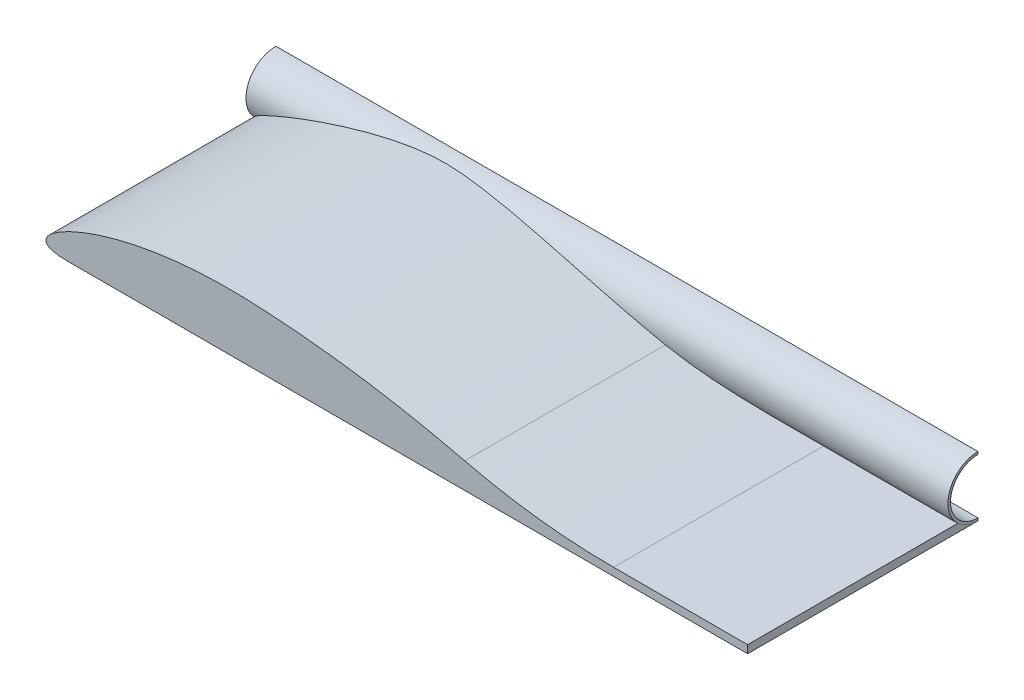
ISO-10303-21;
HEADER;
FILE_DESCRIPTION(('STEP AP214'),'2;1');
FILE_NAME('part.step','',(''),(''),'','','');
FILE_SCHEMA(('AUTOMOTIVE_DESIGN { 1 0 10303 214 1 1 1 1 }'));
ENDSEC;
DATA;
#1=APPLICATION_CONTEXT('core data for automotive mechanical design processes');
#2=APPLICATION_PROTOCOL_DEFINITION('international standard','automotive_design',2000,#1);
#3=PRODUCT_CONTEXT('',#1,'mechanical');
#4=PRODUCT('Part','Part','',(#3));
#5=PRODUCT_RELATED_PRODUCT_CATEGORY('part','',(#4));
#6=PRODUCT_DEFINITION_FORMATION('','',#4);
#7=PRODUCT_DEFINITION_CONTEXT('part definition',#1,'design');
#8=PRODUCT_DEFINITION('design','',#6,#7);
#9=PRODUCT_DEFINITION_SHAPE('','',#8);
#10=(LENGTH_UNIT() NAMED_UNIT(*) SI_UNIT(.MILLI.,.METRE.));
#11=(NAMED_UNIT(*) PLANE_ANGLE_UNIT() SI_UNIT($,.RADIAN.));
#12=(NAMED_UNIT(*) SI_UNIT($,.STERADIAN.) SOLID_ANGLE_UNIT());
#13=UNCERTAINTY_MEASURE_WITH_UNIT(LENGTH_MEASURE(1.E-05),#10,'distance_accuracy_value','');
#14=(GEOMETRIC_REPRESENTATION_CONTEXT(3) GLOBAL_UNCERTAINTY_ASSIGNED_CONTEXT((#13)) GLOBAL_UNIT_ASSIGNED_CONTEXT((#10,
#11,#12)) REPRESENTATION_CONTEXT('',''));
#15=CARTESIAN_POINT('',(0.,0.,0.));
#16=DIRECTION('',(0.,0.,1.));
#17=DIRECTION('',(1.,0.,0.));
#18=AXIS2_PLACEMENT_3D('',#15,#16,#17);
#19=CARTESIAN_POINT('',(0.,0.,0.));
#20=DIRECTION('',(0.,0.,1.));
#21=DIRECTION('',(1.,0.,0.));
#22=AXIS2_PLACEMENT_3D('',#19,#20,#21);
#23=PLANE('',#22);
#24=DIRECTION('',(0.,1.,0.));
#25=VECTOR('',#24,1.);
#26=CARTESIAN_POINT('',(-1.16956159429626,0.,0.));
#27=LINE('',#26,#25);
#28=CARTESIAN_POINT('',(-1.16956159429626,-3.58400593643312,0.));
#29=VERTEX_POINT('',#28);
#30=CARTESIAN_POINT('',(-1.16956159429626,-1.55200593643312,0.));
#31=VERTEX_POINT('',#30);
#32=EDGE_CURVE('E121',#29,#31,#27,.T.);
#33=ORIENTED_EDGE('',*,*,#32,.T.);
#34=DIRECTION('',(1.,0.,0.));
#35=VECTOR('',#34,1.);
#36=CARTESIAN_POINT('',(-52.6289643327539,-1.55200593643312,0.));
#37=LINE('',#36,#35);
#38=CARTESIAN_POINT('',(563.880012,-1.55200593643312,0.));
#39=VERTEX_POINT('',#38);
#40=EDGE_CURVE('E108',#31,#39,#37,.T.);
#41=ORIENTED_EDGE('',*,*,#40,.T.);
#42=DIRECTION('',(0.,1.,0.));
#43=VECTOR('',#42,1.);
#44=CARTESIAN_POINT('',(563.880012,0.,0.));
#45=LINE('',#44,#43);
#46=CARTESIAN_POINT('',(563.880006,-3.58400593643312,0.));
#47=VERTEX_POINT('',#46);
#48=EDGE_CURVE('E118',#47,#39,#45,.T.);
#49=ORIENTED_EDGE('',*,*,#48,.F.);
#50=DIRECTION('',(1.,0.,0.));
#51=VECTOR('',#50,1.);
#52=CARTESIAN_POINT('',(0.,-3.58400593643312,0.));
#53=LINE('',#52,#51);
#54=CARTESIAN_POINT('',(16.8244862805457,-3.58400593643312,0.));
#55=VERTEX_POINT('',#54);
#56=EDGE_CURVE('E139',#55,#47,#53,.T.);
#57=ORIENTED_EDGE('',*,*,#56,.F.);
#58=DIRECTION('',(1.,0.,0.));
#59=VECTOR('',#58,1.);
#60=CARTESIAN_POINT('',(-1.16956159429626,-3.58400593643312,0.));
#61=LINE('',#60,#59);
#62=EDGE_CURVE('E193',#29,#55,#61,.T.);
#63=ORIENTED_EDGE('',*,*,#62,.F.);
#64=EDGE_LOOP('',(#33,#41,#49,#57,#63));
#65=FACE_BOUND('',#64,.T.);
#66=ADVANCED_FACE('F35',(#65),#23,.F.);
#67=CARTESIAN_POINT('',(0.,2.76599406356662,185.42));
#68=DIRECTION('',(0.,-1.,0.));
#69=DIRECTION('',(1.,0.,0.));
#70=AXIS2_PLACEMENT_3D('',#67,#68,#69);
#71=PLANE('',#70);
#72=DIRECTION('',(1.,0.,0.));
#73=VECTOR('',#72,1.);
#74=CARTESIAN_POINT('',(-1.16956159429626,2.76599406356663,16.3134453749044));
#75=LINE('',#74,#73);
#76=CARTESIAN_POINT('',(455.986702340772,2.76599406356692,16.3134453749048));
#77=VERTEX_POINT('',#76);
#78=CARTESIAN_POINT('',(563.88,2.76599406356663,16.3134453749044));
#79=VERTEX_POINT('',#78);
#80=EDGE_CURVE('E128',#77,#79,#75,.T.);
#81=ORIENTED_EDGE('',*,*,#80,.F.);
#82=DIRECTION('',(0.,0.,1.));
#83=VECTOR('',#82,1.);
#84=CARTESIAN_POINT('',(455.986702340772,2.76599406356683,185.42));
#85=LINE('',#84,#83);
#86=CARTESIAN_POINT('',(455.986702340772,2.76599406356683,185.42));
#87=VERTEX_POINT('',#86);
#88=EDGE_CURVE('E62',#77,#87,#85,.T.);
#89=ORIENTED_EDGE('',*,*,#88,.T.);
#90=DIRECTION('',(-1.,0.,0.));
#91=VECTOR('',#90,1.);
#92=CARTESIAN_POINT('',(0.,2.76599406356662,185.42));
#93=LINE('',#92,#91);
#94=CARTESIAN_POINT('',(563.88,2.76599406356688,185.42));
#95=VERTEX_POINT('',#94);
#96=EDGE_CURVE('E135',#95,#87,#93,.T.);
#97=ORIENTED_EDGE('',*,*,#96,.F.);
#98=DIRECTION('',(0.,0.,-1.));
#99=VECTOR('',#98,1.);
#100=CARTESIAN_POINT('',(563.88,2.76599406356688,185.42));
#101=LINE('',#100,#99);
#102=EDGE_CURVE('E215',#95,#79,#101,.T.);
#103=ORIENTED_EDGE('',*,*,#102,.T.);
#104=EDGE_LOOP('',(#81,#89,#97,#103));
#105=FACE_BOUND('',#104,.T.);
#106=ADVANCED_FACE('F155',(#105),#71,.F.);
#107=CARTESIAN_POINT('',(397.402740733893,0.,185.42));
#108=CARTESIAN_POINT('',(397.411698055032,0.038885320403436,185.42));
#109=CARTESIAN_POINT('',(395.109063505421,0.667730492670391,185.42));
#110=CARTESIAN_POINT('',(392.784748718469,1.49199113491221,185.42));
#111=CARTESIAN_POINT('',(387.041714069542,3.20797201327392,185.42));
#112=CARTESIAN_POINT('',(379.954865000334,5.35658969865723,185.42));
#113=CARTESIAN_POINT('',(370.615780699372,8.05897955921893,185.42));
#114=CARTESIAN_POINT('',(359.507412748466,11.1431063312715,185.42));
#115=CARTESIAN_POINT('',(346.598869357543,14.5438713747355,185.42));
#116=CARTESIAN_POINT('',(332.061103090113,18.1288417989651,185.42));
#117=CARTESIAN_POINT('',(316.038892879882,21.8064155050036,185.42));
#118=CARTESIAN_POINT('',(298.691944357754,25.449886624153,185.42));
#119=CARTESIAN_POINT('',(280.209065946268,28.9588443293727,185.42));
#120=CARTESIAN_POINT('',(260.784413321996,32.2270252294116,185.42));
#121=CARTESIAN_POINT('',(240.627196048796,35.1598340983636,185.42));
#122=CARTESIAN_POINT('',(219.959471218607,37.67781805282,185.42));
#123=CARTESIAN_POINT('',(199.01149733823,39.7118853380755,185.42));
#124=CARTESIAN_POINT('',(178.012037109444,41.1804944444643,185.42));
#125=CARTESIAN_POINT('',(157.089436587516,42.139263372195,185.42));
#126=CARTESIAN_POINT('',(136.464680266551,42.2131749394883,185.42));
#127=CARTESIAN_POINT('',(116.414649466667,41.217940478165,185.42));
#128=CARTESIAN_POINT('',(97.30433097571,39.2984877838289,185.42));
#129=CARTESIAN_POINT('',(79.3799866186788,36.5495213442708,185.42));
#130=CARTESIAN_POINT('',(62.8681190648392,33.1147834871376,185.42));
#131=CARTESIAN_POINT('',(47.9655542938233,29.1739071161229,185.42));
#132=CARTESIAN_POINT('',(34.850979219968,24.8995128608497,185.42));
#133=CARTESIAN_POINT('',(23.6592605092071,20.5034094565773,185.42));
#134=CARTESIAN_POINT('',(14.5152980764796,16.1324942141789,185.42));
#135=CARTESIAN_POINT('',(7.44822395064549,12.0104976420917,185.42));
#136=CARTESIAN_POINT('',(2.54712627731124,8.16899422843115,185.42));
#137=CARTESIAN_POINT('',(-0.453384309126816,4.79279174210024,185.42));
#138=CARTESIAN_POINT('',(-1.16956159429625,1.10557529626499,185.42));
#139=CARTESIAN_POINT('',(1.41486830061476,-1.60410388651566,185.42));
#140=CARTESIAN_POINT('',(5.70098263570552,-2.84077269687765,185.42));
#141=CARTESIAN_POINT('',(11.7555244989561,-3.57445206902531,185.42));
#142=CARTESIAN_POINT('',(19.6987641608015,-3.6327457960979,185.42));
#143=CARTESIAN_POINT('',(29.4506872946603,-3.17318046215981,185.42));
#144=CARTESIAN_POINT('',(40.9133147322604,-2.23102229721433,185.42));
#145=CARTESIAN_POINT('',(53.9547343819028,-0.933620653111706,185.42));
#146=CARTESIAN_POINT('',(68.4418443218216,0.603641828697804,185.42));
#147=CARTESIAN_POINT('',(84.2200775935775,2.26179395625605,185.42));
#148=CARTESIAN_POINT('',(101.146412331284,3.90001725460771,185.42));
#149=CARTESIAN_POINT('',(119.057408579271,5.37100954783997,185.42));
#150=CARTESIAN_POINT('',(137.798850975262,6.57353185564482,185.42));
#151=CARTESIAN_POINT('',(157.307672245746,7.34803820882025,185.42));
#152=CARTESIAN_POINT('',(177.401590339587,7.7535348034742,185.42));
#153=CARTESIAN_POINT('',(197.867291710901,8.10629507872485,185.42));
#154=CARTESIAN_POINT('',(218.383935910607,8.25382990528894,185.42));
#155=CARTESIAN_POINT('',(238.720913992722,8.21180933346506,185.42));
#156=CARTESIAN_POINT('',(258.65927683326,7.95581265533055,185.42));
#157=CARTESIAN_POINT('',(277.981187946263,7.50085728926565,185.42));
#158=CARTESIAN_POINT('',(296.474222895194,6.86319583158048,185.42));
#159=CARTESIAN_POINT('',(313.932531106465,6.08399675056258,185.42));
#160=CARTESIAN_POINT('',(330.158311416149,5.19874258601101,185.42));
#161=CARTESIAN_POINT('',(344.958833394524,4.26578253175616,185.42));
#162=CARTESIAN_POINT('',(358.177232855869,3.32463445264578,185.42));
#163=CARTESIAN_POINT('',(369.605973842651,2.44215040704408,185.42));
#164=CARTESIAN_POINT('',(379.256357552193,1.63364963837423,185.42));
#165=CARTESIAN_POINT('',(386.613193972221,1.00338863630718,185.42));
#166=CARTESIAN_POINT('',(392.568540150879,0.420302648445525,185.42));
#167=CARTESIAN_POINT('',(395.032189851431,0.277232580315452,185.42));
#168=CARTESIAN_POINT('',(397.393838715057,-0.0386452432959012,185.42));
#169=CARTESIAN_POINT('',(397.402740733893,0.,185.42));
#170=B_SPLINE_CURVE_WITH_KNOTS('',3,(#107,#108,#109,#110,#111,#112,#113,#114,#115,#116,#117,
#118,#119,#120,#121,#122,#123,#124,#125,#126,#127,#128,#129,#130,#131,#132,#133,#134,#135,#136,
#137,#138,#139,#140,#141,#142,#143,#144,#145,#146,#147,#148,#149,#150,#151,#152,#153,#154,#155,
#156,#157,#158,#159,#160,#161,#162,#163,#164,#165,#166,#167,#168,#169),.UNSPECIFIED.,.T.,.F.,(4,
1,1,1,1,1,1,1,1,1,1,1,1,1,1,1,1,1,1,1,1,1,1,1,1,1,1,1,1,1,1,1,1,1,1,1,1,1,1,1,1,1,1,1,1,1,1,1,1,
1,1,1,1,1,1,1,1,1,1,1,4),(0.,0.00137455348322331,0.00548449728179396,0.0122733609908927,
0.021682195504866,0.0335806119079948,0.0478307427867091,0.0643059527211734,0.082777332043007,
0.103063756455997,0.124929016786915,0.148149110667858,0.172444694611559,0.197572105868171,
0.223268880537162,0.249227774933554,0.275186209349679,0.300900708934774,0.326462938278696,
0.351222485186767,0.374905858971967,0.397269706218861,0.418072413969665,0.437079533175026,
0.454093093767394,0.468919631578705,0.48139171235289,0.491447126518173,0.499023571234557,
0.504293734329401,0.507921918342,0.511539686153778,0.516780527527172,0.524216490268905,
0.533991629403711,0.546033957270731,0.560220284382465,0.576403357410148,0.594370816485922,
0.613951103581465,0.634916884969972,0.657088503485648,0.680229909573905,0.704175481107386,
0.72909036740664,0.754353775526935,0.779667752347888,0.804760119952374,0.829359338708984,
0.853208710008459,0.876041363199166,0.897604065496152,0.917662212410958,0.935969860405553,
0.952309787739252,0.966502759006892,0.978350082728452,0.987731492337842,0.994510920242662,
0.998633932979557,1.),.UNSPECIFIED.);
#171=DIRECTION('',(0.,0.,-1.));
#172=VECTOR('',#171,1.);
#173=SURFACE_OF_LINEAR_EXTRUSION('',#170,#172);
#174=CARTESIAN_POINT('',(336.21803103568,17.0864771967916,23.8807169709893));
#175=CARTESIAN_POINT('',(335.437780249943,17.2757644204646,23.9081364651268));
#176=CARTESIAN_POINT('',(334.657214541211,17.4640931034819,23.9331232093968));
#177=CARTESIAN_POINT('',(333.095490141557,17.8388368753126,23.978403647457));
#178=CARTESIAN_POINT('',(332.314331452396,18.0252519697809,23.9986973551197));
#179=CARTESIAN_POINT('',(329.969668457196,18.5817158477031,24.0528057971885));
#180=CARTESIAN_POINT('',(328.405322557292,18.9488994591967,24.0798358683195));
#181=CARTESIAN_POINT('',(325.274298396243,19.6754861046501,24.1170368268345));
#182=CARTESIAN_POINT('',(323.707619725699,20.0348875421759,24.127204286764));
#183=CARTESIAN_POINT('',(320.572171296696,20.7457180526098,24.1317911536522));
#184=CARTESIAN_POINT('',(319.003401244768,21.0971458458174,24.1262080505537));
#185=CARTESIAN_POINT('',(315.864013538495,21.7918122816116,24.1003250906715));
#186=CARTESIAN_POINT('',(314.293395719207,22.1350501239534,24.0800238017986));
#187=CARTESIAN_POINT('',(311.141886800089,22.8151773024117,24.0255017960916));
#188=CARTESIAN_POINT('',(309.560987134852,23.152020729293,23.9912043137153));
#189=CARTESIAN_POINT('',(306.397858783431,23.8174039442358,23.9095612296842));
#190=CARTESIAN_POINT('',(304.815630163918,24.1459441258267,23.8622162476824));
#191=CARTESIAN_POINT('',(301.650104291215,24.7947314517675,23.7552774422097));
#192=CARTESIAN_POINT('',(300.066807204176,25.1149796713707,23.6956852159382));
#193=CARTESIAN_POINT('',(296.89940616505,25.7471889334053,23.5649873717921));
#194=CARTESIAN_POINT('',(295.315302474069,26.0591518210568,23.4938843429376));
#195=CARTESIAN_POINT('',(292.146532218502,26.6747000738358,23.3408742026462));
#196=CARTESIAN_POINT('',(290.561866009426,26.9782881555916,23.2589706457355));
#197=CARTESIAN_POINT('',(287.194480590991,27.6143599486084,23.0741846792148));
#198=CARTESIAN_POINT('',(285.411627483541,27.9457447495862,22.9699600476065));
#199=CARTESIAN_POINT('',(281.84469517669,28.597922590884,22.7495457402765));
#200=CARTESIAN_POINT('',(280.060615958892,28.9187154685767,22.6333558809545));
#201=CARTESIAN_POINT('',(276.491336141933,29.5496379793594,22.3898551133518));
#202=CARTESIAN_POINT('',(274.706135538111,29.8597675678198,22.2625441585332));
#203=CARTESIAN_POINT('',(267.56439866628,31.0786416986716,21.7327842358815));
#204=CARTESIAN_POINT('',(262.20344871317,31.9445554313976,21.2891361659619));
#205=CARTESIAN_POINT('',(255.049349438321,33.0339672147566,20.6496287341452));
#206=CARTESIAN_POINT('',(253.259752555489,33.3009716910499,20.4857002206553));
#207=CARTESIAN_POINT('',(249.679627756892,33.8240631151889,20.1505899717768));
#208=CARTESIAN_POINT('',(247.889099840435,34.0801500549142,19.9794082309934));
#209=CARTESIAN_POINT('',(244.307146367711,34.5813595143561,19.6305537413636));
#210=CARTESIAN_POINT('',(242.5157208113,34.8264820323191,19.452880991479));
#211=CARTESIAN_POINT('',(238.93024398061,35.3059515824793,19.0916403565722));
#212=CARTESIAN_POINT('',(237.13619184107,35.5402879835165,18.9080669459511));
#213=CARTESIAN_POINT('',(233.547180237933,35.9978457415093,18.5360222836183));
#214=CARTESIAN_POINT('',(231.752220774892,36.2210671052663,18.3475510349038));
#215=CARTESIAN_POINT('',(228.16137018703,36.6563063880655,17.9665905234793));
#216=CARTESIAN_POINT('',(226.365479062006,36.8683243046453,17.7741012598862));
#217=CARTESIAN_POINT('',(222.770246011707,37.2813606585815,17.3857662035378));
#218=CARTESIAN_POINT('',(220.970902752225,37.482363453226,17.1899161308046));
#219=CARTESIAN_POINT('',(217.371201905939,37.8729401695694,16.7961517683325));
#220=CARTESIAN_POINT('',(215.570844319171,38.0625140916828,16.5982374786685));
#221=CARTESIAN_POINT('',(211.969011243518,38.4299433460895,16.2016767374777));
#222=CARTESIAN_POINT('',(210.167535752775,38.6077986588607,16.0030302847317));
#223=CARTESIAN_POINT('',(206.560162704245,38.9518176947631,15.6061407212753));
#224=CARTESIAN_POINT('',(204.75426296622,39.1179601478332,15.4078989485036));
#225=CARTESIAN_POINT('',(202.04439918073,39.3579348607536,15.1123758416213));
#226=CARTESIAN_POINT('',(201.140942642942,39.4363865696056,15.0141747766205));
#227=CARTESIAN_POINT('',(199.333670786919,39.5901665100613,14.8186323635675));
#228=CARTESIAN_POINT('',(198.429855468713,39.6654947419234,14.7212910154441));
#229=CARTESIAN_POINT('',(195.717871356897,39.8868070132679,14.4308391308907));
#230=CARTESIAN_POINT('',(193.909150854239,40.0281198287577,14.2392992702794));
#231=CARTESIAN_POINT('',(190.295079448347,40.2982802896058,13.8620977790733));
#232=CARTESIAN_POINT('',(188.489732458599,40.427160239574,13.676421806631));
#233=CARTESIAN_POINT('',(185.78060758023,40.6116920458634,13.4028641998069));
#234=CARTESIAN_POINT('',(184.877377020335,40.671738261281,13.3125039161364));
#235=CARTESIAN_POINT('',(183.070548723964,40.7889444547251,13.1335940417415));
#236=CARTESIAN_POINT('',(182.166950987431,40.8461044322961,13.0450444513029));
#237=CARTESIAN_POINT('',(180.35936130182,40.9575724323829,12.8699319163806));
#238=CARTESIAN_POINT('',(179.455369342285,41.0118803739253,12.7833690283415));
#239=CARTESIAN_POINT('',(177.647022660845,41.1177128836929,12.6123503991515));
#240=CARTESIAN_POINT('',(176.74266793879,41.1692374507583,12.5278946588784));
#241=CARTESIAN_POINT('',(174.933335444865,41.2692952765926,12.361678451575));
#242=CARTESIAN_POINT('',(174.028357577999,41.3178278513409,12.2799186028441));
#243=CARTESIAN_POINT('',(172.217921090161,41.4115915342971,12.1199157859779));
#244=CARTESIAN_POINT('',(171.312462469457,41.4568226443509,12.0416728158761));
#245=CARTESIAN_POINT('',(168.595322385798,41.5871421364233,11.8134483486243));
#246=CARTESIAN_POINT('',(166.782823934623,41.6668596319258,11.6699663515777));
#247=CARTESIAN_POINT('',(163.155266098217,41.8096775021278,11.4076766279071));
#248=CARTESIAN_POINT('',(161.340206624548,41.8727772881213,11.2888697754669));
#249=CARTESIAN_POINT('',(158.619162663883,41.9531118959471,11.1353281905436));
#250=CARTESIAN_POINT('',(157.714075461504,41.977472389801,11.0883233002016));
#251=CARTESIAN_POINT('',(155.903349991721,42.0212052251831,11.0033854885606));
#252=CARTESIAN_POINT('',(154.99771172441,42.0405775675517,10.9654525657334));
#253=CARTESIAN_POINT('',(153.185986132853,42.0741462015376,10.8994009183943));
#254=CARTESIAN_POINT('',(152.279898812109,42.0883425329016,10.8712821185196));
#255=CARTESIAN_POINT('',(150.46739181745,42.1113662176938,10.8255384469726));
#256=CARTESIAN_POINT('',(149.560972144895,42.120193592861,10.8079135328102));
#257=CARTESIAN_POINT('',(147.748026914232,42.1322889093703,10.7837359015598));
#258=CARTESIAN_POINT('',(146.841501372902,42.1355573491021,10.7771821918763));
#259=CARTESIAN_POINT('',(145.028435462956,42.1363490477795,10.7755962420501));
#260=CARTESIAN_POINT('',(144.121895094336,42.1338723055367,10.7805640042907));
#261=CARTESIAN_POINT('',(142.311160693198,42.1230014498865,10.8023053298265));
#262=CARTESIAN_POINT('',(141.406966239108,42.1146215167402,10.8190506018024));
#263=CARTESIAN_POINT('',(139.598954148636,42.0917861749209,10.8644552405491));
#264=CARTESIAN_POINT('',(138.695136511666,42.0773307757744,10.893114588638));
#265=CARTESIAN_POINT('',(136.888006052622,42.0421514876891,10.9623732427629));
#266=CARTESIAN_POINT('',(135.984693277535,42.0214270894939,11.002973518802));
#267=CARTESIAN_POINT('',(134.178838395295,41.9736248621101,11.0957756428429));
#268=CARTESIAN_POINT('',(133.276296289194,41.946547024253,11.1479775066736));
#269=CARTESIAN_POINT('',(130.570031673899,41.8558565274538,11.3209430098039));
#270=CARTESIAN_POINT('',(128.767647345083,41.7827864267359,11.4580674934594));
#271=CARTESIAN_POINT('',(125.166710901385,41.6116405117495,11.7697449410975));
#272=CARTESIAN_POINT('',(123.368160450949,41.5135554564256,11.9443117332668));
#273=CARTESIAN_POINT('',(119.775855765217,41.2926419276118,12.3240286729485));
#274=CARTESIAN_POINT('',(117.982101505191,41.169813581956,12.5291786624539));
#275=CARTESIAN_POINT('',(114.399339030709,40.8996259234042,12.9634884900372));
#276=CARTESIAN_POINT('',(112.610330927383,40.7522660411663,13.1926488853164));
#277=CARTESIAN_POINT('',(109.038750594483,40.4327024525345,13.6696020527682));
#278=CARTESIAN_POINT('',(107.256173914911,40.2605220751153,13.9173772252046));
#279=CARTESIAN_POINT('',(103.695757916973,39.8907242456594,14.4269687605812));
#280=CARTESIAN_POINT('',(101.917918410347,39.693107820351,14.6887845565218));
#281=CARTESIAN_POINT('',(98.3668347678396,39.2719190488373,15.2220920010598));
#282=CARTESIAN_POINT('',(96.5935904733706,39.0483476109089,15.4935833108393));
#283=CARTESIAN_POINT('',(93.7206589935704,38.66415127655,15.9386374709549));
#284=CARTESIAN_POINT('',(92.6196060211255,38.5116567824939,16.1104463409451));
#285=CARTESIAN_POINT('',(90.4192193531206,38.196242615101,16.455401788262));
#286=CARTESIAN_POINT('',(89.3198856373877,38.0333230650413,16.6285483497489));
#287=CARTESIAN_POINT('',(86.0231005984866,37.5284823089804,17.1489252986803));
#288=CARTESIAN_POINT('',(83.8281770518231,37.1706540253763,17.4968877048049));
#289=CARTESIAN_POINT('',(79.4433321853872,36.4110302636396,18.1885048767128));
#290=CARTESIAN_POINT('',(77.2534165891117,36.0091982409592,18.5321557938283));
#291=CARTESIAN_POINT('',(72.8782372907222,35.1597602945237,19.2091140777668));
#292=CARTESIAN_POINT('',(70.692981613937,34.7121032884917,19.5424093495724));
#293=CARTESIAN_POINT('',(66.3268002412746,33.7689097480915,20.1925741722265));
#294=CARTESIAN_POINT('',(64.1458860085736,33.2733021822296,20.5094182524028));
#295=CARTESIAN_POINT('',(60.8786779129846,32.4925139411157,20.9673272532425));
#296=CARTESIAN_POINT('',(59.7891972605699,32.2257314977957,21.1172142138832));
#297=CARTESIAN_POINT('',(57.6125571528389,31.6793538267995,21.410308595));
#298=CARTESIAN_POINT('',(56.525397670581,31.3997587486939,21.5535160934107));
#299=CARTESIAN_POINT('',(54.3656035588251,30.8304719829931,21.8308395192033));
#300=CARTESIAN_POINT('',(53.2929411946209,30.540926036488,21.9650384349396));
#301=CARTESIAN_POINT('',(51.1503100929417,29.9484198728688,22.2251200968922));
#302=CARTESIAN_POINT('',(50.0803413585788,29.6454596402633,22.3510028335042));
#303=CARTESIAN_POINT('',(47.9428147644225,29.0255535692698,22.5934682078983));
#304=CARTESIAN_POINT('',(46.8752583747179,28.7086008249879,22.7100461718544));
#305=CARTESIAN_POINT('',(44.743412846707,28.0603304462427,22.9327084958549));
#306=CARTESIAN_POINT('',(43.6791237011181,27.7290128438225,23.0387928793052));
#307=CARTESIAN_POINT('',(41.5553848316866,27.0517768775667,23.2391101746917));
#308=CARTESIAN_POINT('',(40.4959310533616,26.7058750918946,23.3333560831054));
#309=CARTESIAN_POINT('',(38.3810980026725,25.9985512349405,23.5087070552579));
#310=CARTESIAN_POINT('',(37.3257187571798,25.6371290614915,23.5898120324765));
#311=CARTESIAN_POINT('',(35.7472947869277,25.0833529031845,23.7003074603355));
#312=CARTESIAN_POINT('',(35.2225119504196,24.8970352290271,23.7352460683274));
#313=CARTESIAN_POINT('',(34.1741579475366,24.520345462995,23.8012182369372));
#314=CARTESIAN_POINT('',(33.6505867814558,24.3299733701365,23.8322517966076));
#315=CARTESIAN_POINT('',(32.0818809015699,23.7524986372978,23.9191750145806));
#316=CARTESIAN_POINT('',(31.0387266107245,23.3590280215247,23.9688891372977));
#317=CARTESIAN_POINT('',(28.9615746342044,22.5544639954726,24.0496562534699));
#318=CARTESIAN_POINT('',(27.927560339789,22.1434183000633,24.0807567141052));
#319=CARTESIAN_POINT('',(25.8672490308023,21.301143420327,24.1218676697851));
#320=CARTESIAN_POINT('',(24.8409523695231,20.8699133184631,24.131877205131));
#321=CARTESIAN_POINT('',(23.3090959933879,20.2071316268363,24.1286290915126));
#322=CARTESIAN_POINT('',(22.8000021541528,19.9836674629731,24.1245094640837));
#323=CARTESIAN_POINT('',(21.7844109975159,19.5311303459331,24.109711486415));
#324=CARTESIAN_POINT('',(21.2779136931828,19.3020573645595,24.0990331031965));
#325=CARTESIAN_POINT('',(19.7629069139685,18.6060400173878,24.0563900156995));
#326=CARTESIAN_POINT('',(18.7586975137675,18.1302174745707,24.0138173494594));
#327=CARTESIAN_POINT('',(17.1489248596441,17.3413317600736,23.9181599811556));
#328=CARTESIAN_POINT('',(16.538838754097,17.0361931718669,23.8754451039052));
#329=CARTESIAN_POINT('',(15.3247799835858,16.4158266608963,23.775981784057));
#330=CARTESIAN_POINT('',(14.7208086791396,16.1005965550409,23.7192302868213));
#331=CARTESIAN_POINT('',(13.5197503661535,15.459847752166,23.5901479860661));
#332=CARTESIAN_POINT('',(12.9226656592996,15.1343257439643,23.5178121242087));
#333=CARTESIAN_POINT('',(11.7402453412302,14.4720036796425,23.3554984711941));
#334=CARTESIAN_POINT('',(11.1548730245635,14.1352524921836,23.2655904956099));
#335=CARTESIAN_POINT('',(9.99649433202321,13.4472400772308,23.0649731721339));
#336=CARTESIAN_POINT('',(9.42348482599566,13.0959825898276,22.9542691601857));
#337=CARTESIAN_POINT('',(8.29320316607411,12.3774126750879,22.7084854328563));
#338=CARTESIAN_POINT('',(7.73592359829902,12.0101080263893,22.5734174303804));
#339=CARTESIAN_POINT('',(6.94485560614508,11.4673469975408,22.35771242027));
#340=CARTESIAN_POINT('',(6.70328246881213,11.2986246722996,22.2885018633666));
#341=CARTESIAN_POINT('',(6.22445794203345,10.9577006023473,22.1439795540041));
#342=CARTESIAN_POINT('',(5.98720633120658,10.7854990368276,22.0686681151607));
#343=CARTESIAN_POINT('',(5.51762790670676,10.4374469179565,21.911426963794));
#344=CARTESIAN_POINT('',(5.28530095005399,10.261596470839,21.8294974437496));
#345=CARTESIAN_POINT('',(4.82537655619339,9.90554782034834,21.6581848458848));
#346=CARTESIAN_POINT('',(4.59779857196398,9.72533652770519,21.5687766261917));
#347=CARTESIAN_POINT('',(4.14887715148076,9.3611840613613,21.3822070462579));
#348=CARTESIAN_POINT('',(3.9275337977261,9.17724283835995,21.2850455834883));
#349=CARTESIAN_POINT('',(3.49175218476282,8.80575291730772,21.0824191928644));
#350=CARTESIAN_POINT('',(3.27731395481976,8.61820420397283,20.9769542298244));
#351=CARTESIAN_POINT('',(2.97992054445385,8.35104815348943,20.8218230512104));
#352=CARTESIAN_POINT('',(2.89379887512695,8.27281962009616,20.7758137709185));
#353=CARTESIAN_POINT('',(2.72288956614413,8.1158205548905,20.6822638491923));
#354=CARTESIAN_POINT('',(2.63810192093499,8.03705002533627,20.6347232141351));
#355=CARTESIAN_POINT('',(2.46991131960284,7.87898496417,20.5380710025776));
#356=CARTESIAN_POINT('',(2.38650844498968,7.79969040209392,20.4889593340982));
#357=CARTESIAN_POINT('',(2.22110765885459,7.64063379658332,20.3891489599703));
#358=CARTESIAN_POINT('',(2.13910976091718,7.56087174863875,20.3384502389903));
#359=CARTESIAN_POINT('',(1.97668819417762,7.40076565877651,20.2353389760765));
#360=CARTESIAN_POINT('',(1.89626521165715,7.32042138316065,20.1829257124637));
#361=CARTESIAN_POINT('',(1.73738283815493,7.15903229216853,20.0762423123684));
#362=CARTESIAN_POINT('',(1.65892342204809,7.07798748577389,20.0219721996665));
#363=CARTESIAN_POINT('',(1.42781729934545,6.83452486119947,19.856759090168));
#364=CARTESIAN_POINT('',(1.27853103815986,6.67088991927169,19.7428423875506));
#365=CARTESIAN_POINT('',(0.991616676738238,6.34000909027043,19.5061070763576));
#366=CARTESIAN_POINT('',(0.853982516451356,6.17276513768592,19.3832931575142));
#367=CARTESIAN_POINT('',(0.59274430702545,5.8348820609188,19.1281170061487));
#368=CARTESIAN_POINT('',(0.469129122176069,5.66424575983197,18.9957624906719));
#369=CARTESIAN_POINT('',(0.230543596496989,5.3095257432842,18.7126026879084));
#370=CARTESIAN_POINT('',(0.116581957445357,5.12526342563914,18.5611624338417));
#371=CARTESIAN_POINT('',(-0.0399265576104666,4.84771557244932,18.3258205767437));
#372=CARTESIAN_POINT('',(-0.0897001970946791,4.75498575309494,18.2459903987471));
#373=CARTESIAN_POINT('',(-0.184384846107402,4.56935817767338,18.0836721679909));
#374=CARTESIAN_POINT('',(-0.229295829701255,4.4764604207132,18.0011841010588));
#375=CARTESIAN_POINT('',(-0.314390466165516,4.29043256956035,17.8333777709318));
#376=CARTESIAN_POINT('',(-0.354557913403652,4.1973027291792,17.7480510134962));
#377=CARTESIAN_POINT('',(-0.430039165470832,4.0113606328394,17.5749521486379));
#378=CARTESIAN_POINT('',(-0.465352932810301,3.91854837933916,17.4871800223334));
#379=CARTESIAN_POINT('',(-0.563950712701349,3.64089692631737,17.2203490086233));
#380=CARTESIAN_POINT('',(-0.619910969865356,3.45679966588091,17.0377364466516));
#381=CARTESIAN_POINT('',(-0.711696782155946,3.09140005472354,16.6632173082672));
#382=CARTESIAN_POINT('',(-0.747433219380284,2.91011344638403,16.4712735817324));
#383=CARTESIAN_POINT('',(-0.797186276187322,2.55258332870869,16.079935270652));
#384=CARTESIAN_POINT('',(-0.811200407250837,2.3763403994492,15.8805398351139));
#385=CARTESIAN_POINT('',(-0.815923088994946,2.03111737358674,15.4766417135076));
#386=CARTESIAN_POINT('',(-0.806731628554161,1.86210929710645,15.2721646854443));
#387=CARTESIAN_POINT('',(-0.774277790583912,1.61473332774734,14.9626789147108));
#388=CARTESIAN_POINT('',(-0.760351383502046,1.53330628067278,14.8590672363633));
#389=CARTESIAN_POINT('',(-0.7260025991581,1.37266678331136,14.6511996821372));
#390=CARTESIAN_POINT('',(-0.705580861213077,1.29345411590378,14.5469438706487));
#391=CARTESIAN_POINT('',(-0.660596468601959,1.14581358051131,14.3493360919489));
#392=CARTESIAN_POINT('',(-0.636711835428352,1.0771394682649,14.25601256061));
#393=CARTESIAN_POINT('',(-0.584079362493194,0.941784459809747,14.0692986309087));
#394=CARTESIAN_POINT('',(-0.555331321253868,0.875103646312683,13.9759082299357));
#395=CARTESIAN_POINT('',(-0.46237462918482,0.678071117281476,13.6957894519353));
#396=CARTESIAN_POINT('',(-0.391457671314073,0.55074278937924,13.509131569117));
#397=CARTESIAN_POINT('',(-0.23438253802996,0.303672188931612,13.1360426341415));
#398=CARTESIAN_POINT('',(-0.148160564915337,0.183964636762771,12.9496159552002));
#399=CARTESIAN_POINT('',(0.0369158066701338,-0.0475611487032957,12.5781666917782));
#400=CARTESIAN_POINT('',(0.135770878315633,-0.159378961090059,12.3931441826779));
#401=CARTESIAN_POINT('',(0.357991257077935,-0.389720335515673,12.0004663114276));
#402=CARTESIAN_POINT('',(0.482869480361258,-0.507180970896238,11.7930469829677));
#403=CARTESIAN_POINT('',(0.744562505966507,-0.73294489046613,11.3806390699116));
#404=CARTESIAN_POINT('',(0.881383144424767,-0.841243645854311,11.1756517300157));
#405=CARTESIAN_POINT('',(1.16592303502707,-1.04902812918114,10.7686626515185));
#406=CARTESIAN_POINT('',(1.31364645473452,-1.14851045474662,10.5666620903925));
#407=CARTESIAN_POINT('',(1.62001500163076,-1.33854270331509,10.1672415637946));
#408=CARTESIAN_POINT('',(1.77864564380967,-1.42910409880575,9.96981597161067));
#409=CARTESIAN_POINT('',(2.10721848153324,-1.60145184165884,9.58085422179622));
#410=CARTESIAN_POINT('',(2.27715350677242,-1.68324366711198,9.38931444145847));
#411=CARTESIAN_POINT('',(2.62823161808788,-1.83824354444994,9.0135499611338));
#412=CARTESIAN_POINT('',(2.80936258573341,-1.91146063736158,8.82931769434205));
#413=CARTESIAN_POINT('',(3.10907074390917,-2.02259924240637,8.53986037950882));
#414=CARTESIAN_POINT('',(3.22423545746327,-2.06307786199775,8.43205698077014));
#415=CARTESIAN_POINT('',(3.45831295914773,-2.14120586602283,8.21953021156483));
#416=CARTESIAN_POINT('',(3.57722581643838,-2.17885519820744,8.11480689800055));
#417=CARTESIAN_POINT('',(3.81858379175077,-2.25154671744502,7.908289083079));
#418=CARTESIAN_POINT('',(3.94103276181716,-2.28658590009359,7.8064980370604));
#419=CARTESIAN_POINT('',(4.18885935241627,-2.35424687301522,7.60572738648973));
#420=CARTESIAN_POINT('',(4.31423696563219,-2.38686866932691,7.50674777491507));
#421=CARTESIAN_POINT('',(4.56763329094847,-2.45006473785203,7.31086899721645));
#422=CARTESIAN_POINT('',(4.69565788309421,-2.48063362036482,7.21397572894317));
#423=CARTESIAN_POINT('',(4.88888295994097,-2.52513703507231,7.06981845342907));
#424=CARTESIAN_POINT('',(4.95349041484416,-2.53974674930353,7.02196236107073));
#425=CARTESIAN_POINT('',(5.08298228419481,-2.56856662090151,6.92650499402223));
#426=CARTESIAN_POINT('',(5.14786669913354,-2.5827767775592,6.87890371978438));
#427=CARTESIAN_POINT('',(5.34301972649676,-2.62489359052617,6.73622339590327));
#428=CARTESIAN_POINT('',(5.47360086480412,-2.65224377227915,6.64140664396444));
#429=CARTESIAN_POINT('',(5.73562187474583,-2.70547882861728,6.45256041274322));
#430=CARTESIAN_POINT('',(5.86706172495546,-2.73136373960616,6.35853091395153));
#431=CARTESIAN_POINT('',(6.26259576013184,-2.80686124354327,6.07771481316259));
#432=CARTESIAN_POINT('',(6.52797244497001,-2.85433125423404,5.89215083099515));
#433=CARTESIAN_POINT('',(7.06448489931994,-2.94421305558157,5.52299571505698));
#434=CARTESIAN_POINT('',(7.33565087726694,-2.98657622048567,5.33943670195628));
#435=CARTESIAN_POINT('',(7.88085615829274,-3.0659628097386,4.97662646340965));
#436=CARTESIAN_POINT('',(8.15488890566845,-3.10299638214586,4.79736760756286));
#437=CARTESIAN_POINT('',(8.70591636713,-3.17208337895772,4.44322110272764));
#438=CARTESIAN_POINT('',(8.98290716247664,-3.2041426853357,4.26832849936865));
#439=CARTESIAN_POINT('',(9.53987089462689,-3.26364187864894,3.92286320659762));
#440=CARTESIAN_POINT('',(9.8198423036104,-3.29108402149437,3.75228844233622));
#441=CARTESIAN_POINT('',(10.2419151366246,-3.32905578432804,3.49945056845879));
#442=CARTESIAN_POINT('',(10.38296887808,-3.34118188412242,3.41566943100865));
#443=CARTESIAN_POINT('',(10.6657181302733,-3.36441438369809,3.24905306938298));
#444=CARTESIAN_POINT('',(10.8074136413748,-3.37552078290166,3.16621784574339));
#445=CARTESIAN_POINT('',(11.0655299484771,-3.39482964334323,3.01636878475577));
#446=CARTESIAN_POINT('',(11.1818594192369,-3.40319282808481,2.94921809113845));
#447=CARTESIAN_POINT('',(11.4148576754416,-3.41928869446141,2.81543265195932));
#448=CARTESIAN_POINT('',(11.5315264601784,-3.42702137741121,2.74879790532188));
#449=CARTESIAN_POINT('',(11.8821477904899,-3.449297716038,2.54965177522042));
#450=CARTESIAN_POINT('',(12.1166221314079,-3.46291271341672,2.41795261124448));
#451=CARTESIAN_POINT('',(12.5869924213361,-3.48777787348406,2.15682847424868));
#452=CARTESIAN_POINT('',(12.8228885289645,-3.49902776709302,2.02740376152827));
#453=CARTESIAN_POINT('',(13.2952705274622,-3.51923785282053,1.77142297745877));
#454=CARTESIAN_POINT('',(13.5317515352769,-3.52820585087557,1.64485851376143));
#455=CARTESIAN_POINT('',(14.006095752617,-3.54401663023784,1.3942888148052));
#456=CARTESIAN_POINT('',(14.2439587729125,-3.5508596958233,1.27028323928652));
#457=CARTESIAN_POINT('',(14.7211014970856,-3.56254041539935,1.024960710572));
#458=CARTESIAN_POINT('',(14.9603811299529,-3.56737816906098,0.903643624032587));
#459=CARTESIAN_POINT('',(15.4592334592624,-3.57547715222841,0.654421271194019));
#460=CARTESIAN_POINT('',(15.7189240205766,-3.57858472666731,0.526746880308712));
#461=CARTESIAN_POINT('',(16.2401066788621,-3.58276973236639,0.274832350876198));
#462=CARTESIAN_POINT('',(16.5015994238728,-3.5838463905131,0.150593537883932));
#463=CARTESIAN_POINT('',(16.7841235407885,-3.58400045750135,0.0187901506153945));
#464=CARTESIAN_POINT('',(16.8043023738153,-3.58400593835941,0.00938959114228781));
#465=CARTESIAN_POINT('',(16.8244862805457,-3.58400593643312,0.));
#466=B_SPLINE_CURVE_WITH_KNOTS('',3,(#174,#175,#176,#177,#178,#179,#180,#181,#182,#183,#184,
#185,#186,#187,#188,#189,#190,#191,#192,#193,#194,#195,#196,#197,#198,#199,#200,#201,#202,#203,
#204,#205,#206,#207,#208,#209,#210,#211,#212,#213,#214,#215,#216,#217,#218,#219,#220,#221,#222,
#223,#224,#225,#226,#227,#228,#229,#230,#231,#232,#233,#234,#235,#236,#237,#238,#239,#240,#241,
#242,#243,#244,#245,#246,#247,#248,#249,#250,#251,#252,#253,#254,#255,#256,#257,#258,#259,#260,
#261,#262,#263,#264,#265,#266,#267,#268,#269,#270,#271,#272,#273,#274,#275,#276,#277,#278,#279,
#280,#281,#282,#283,#284,#285,#286,#287,#288,#289,#290,#291,#292,#293,#294,#295,#296,#297,#298,
#299,#300,#301,#302,#303,#304,#305,#306,#307,#308,#309,#310,#311,#312,#313,#314,#315,#316,#317,
#318,#319,#320,#321,#322,#323,#324,#325,#326,#327,#328,#329,#330,#331,#332,#333,#334,#335,#336,
#337,#338,#339,#340,#341,#342,#343,#344,#345,#346,#347,#348,#349,#350,#351,#352,#353,#354,#355,
#356,#357,#358,#359,#360,#361,#362,#363,#364,#365,#366,#367,#368,#369,#370,#371,#372,#373,#374,
#375,#376,#377,#378,#379,#380,#381,#382,#383,#384,#385,#386,#387,#388,#389,#390,#391,#392,#393,
#394,#395,#396,#397,#398,#399,#400,#401,#402,#403,#404,#405,#406,#407,#408,#409,#410,#411,#412,
#413,#414,#415,#416,#417,#418,#419,#420,#421,#422,#423,#424,#425,#426,#427,#428,#429,#430,#431,
#432,#433,#434,#435,#436,#437,#438,#439,#440,#441,#442,#443,#444,#445,#446,#447,#448,#449,#450,
#451,#452,#453,#454,#455,#456,#457,#458,#459,#460,#461,#462,#463,#464,#465),.UNSPECIFIED.,.F.,
.F.,(4,2,2,2,2,2,2,2,2,2,2,2,2,2,2,2,2,2,2,2,2,2,2,2,2,2,2,2,2,2,2,2,2,2,2,2,2,2,2,2,2,2,2,2,2,
2,2,2,2,2,2,2,2,2,2,2,2,2,2,2,2,2,2,2,2,2,2,2,2,2,2,2,2,2,2,2,2,2,2,2,2,2,2,2,2,2,2,2,2,2,2,2,2,
2,2,2,2,2,2,2,2,2,2,2,2,2,2,2,2,2,2,2,2,2,2,2,2,2,2,2,2,2,2,2,2,2,2,2,2,2,2,2,2,2,2,2,2,2,2,2,2,
2,2,2,2,4),(0.,2.41004315459583,4.82007918505831,9.64121782088118,14.4633362699123,
19.2862232296763,24.1095795225254,28.959754066907,33.8096983061028,38.659010450641,
43.5072333950537,48.3538647204851,53.8029377732484,59.2520944517197,64.7012739340515,
81.044926123437,86.4953591579106,91.9457962463534,97.3962342065271,102.851934044944,
108.307630544927,113.763328243964,119.226582901279,124.689837360418,130.15310092055,
135.626042768449,138.362511146832,141.09897929885,146.571874547091,152.030143139338,
154.759306836427,157.488470964214,160.217712535187,162.946955243374,165.676819606795,
168.406682443815,173.866248888183,179.326008719464,182.045862101349,184.765715025092,
187.48554706261,190.205368087343,192.924945251941,195.644522979104,198.357590092339,
201.070652951398,203.783936262884,206.497223276286,211.923726692376,217.352237685231,
222.780720632872,228.209329585384,233.632869018339,239.056189598238,244.479320450118,
247.853560768492,251.227761193616,257.980178740633,264.738247234284,271.503932894863,
278.279798986985,281.674639734164,285.069440861181,288.42672228224,291.784007580492,
295.142968780954,298.5019224891,301.857155840447,305.212411281868,306.886298976469,
308.560187077252,311.90787666117,315.246992432076,318.586260139207,320.254177248784,
321.922102745046,325.2573494591,327.307574441182,329.358245984747,331.409584136138,
333.452932004392,335.495756295316,337.537601110203,338.445552441325,339.353457128786,
340.261335420415,341.172398947927,342.08347452534,342.994553963599,343.369882364876,
343.74520920334,344.120558056388,344.495910536583,344.871423094872,345.246930845778,
345.993764176037,346.740206674376,347.486052034537,348.278063377346,348.674251434387,
349.070441604367,349.467948376592,349.865458218966,350.660293632978,351.458604812733,
352.257007440693,353.051975766378,353.449369481799,353.846724094978,354.20150879606,
354.556308198508,355.265975598665,355.978673798628,356.69140999169,357.498220240489,
358.30542700066,359.112943927965,359.919408430824,360.725366187524,361.530466358409,
362.018954343609,362.507451347612,362.996502214041,363.485551858778,363.97583894407,
364.220990491798,364.466142474549,364.957157363962,365.448160049061,366.429908838446,
367.420369823911,368.408919189497,369.396290556542,370.383178091804,370.876692549534,
371.370207286869,371.773943615349,372.177679101897,372.985473977001,373.793360705873,
374.598445481033,375.403422503701,376.208359511385,377.076513868081,377.944998640405,
378.011781874052),.UNSPECIFIED.);
#467=CARTESIAN_POINT('',(336.218031035527,17.0864771968284,23.8807169709946));
#468=VERTEX_POINT('',#467);
#469=EDGE_CURVE('E126',#55,#468,#466,.F.);
#470=ORIENTED_EDGE('',*,*,#469,.F.);
#471=DIRECTION('',(0.,0.,-1.));
#472=VECTOR('',#471,1.);
#473=CARTESIAN_POINT('',(16.8244862805457,-3.58400593643312,185.42));
#474=LINE('',#473,#472);
#475=CARTESIAN_POINT('',(16.8244862805457,-3.58400593643312,185.42));
#476=VERTEX_POINT('',#475);
#477=EDGE_CURVE('E220',#476,#55,#474,.T.);
#478=ORIENTED_EDGE('',*,*,#477,.F.);
#479=CARTESIAN_POINT('',(336.218031035531,17.0864771968276,185.42));
#480=VERTEX_POINT('',#479);
#481=EDGE_CURVE('E138',#480,#476,#170,.T.);
#482=ORIENTED_EDGE('',*,*,#481,.F.);
#483=DIRECTION('',(0.,0.,-1.));
#484=VECTOR('',#483,1.);
#485=CARTESIAN_POINT('',(336.218031035528,17.0864771968285,185.42));
#486=LINE('',#485,#484);
#487=EDGE_CURVE('E225',#480,#468,#486,.T.);
#488=ORIENTED_EDGE('',*,*,#487,.T.);
#489=EDGE_LOOP('',(#470,#478,#482,#488));
#490=FACE_BOUND('',#489,.T.);
#491=ADVANCED_FACE('F150',(#490),#173,.F.);
#492=CARTESIAN_POINT('',(563.88,0.,185.42));
#493=DIRECTION('',(-1.,0.,0.));
#494=DIRECTION('',(0.,0.,1.));
#495=AXIS2_PLACEMENT_3D('',#492,#493,#494);
#496=PLANE('',#495);
#497=CARTESIAN_POINT('',(563.88,20.5459940635669,0.));
#498=DIRECTION('',(-1.,0.,0.));
#499=DIRECTION('',(0.,0.,1.));
#500=AXIS2_PLACEMENT_3D('',#497,#498,#499);
#501=CIRCLE('',#500,24.13);
#502=EDGE_CURVE('E190',#79,#47,#501,.F.);
#503=ORIENTED_EDGE('',*,*,#502,.F.);
#504=ORIENTED_EDGE('',*,*,#102,.F.);
#505=DIRECTION('',(0.,1.,0.));
#506=VECTOR('',#505,1.);
#507=CARTESIAN_POINT('',(563.88,0.,185.42));
#508=LINE('',#507,#506);
#509=CARTESIAN_POINT('',(563.88,-3.58400593643312,185.42));
#510=VERTEX_POINT('',#509);
#511=EDGE_CURVE('E218',#510,#95,#508,.T.);
#512=ORIENTED_EDGE('',*,*,#511,.F.);
#513=DIRECTION('',(0.,0.,-1.));
#514=VECTOR('',#513,1.);
#515=CARTESIAN_POINT('',(563.88,-3.58400593643312,185.42));
#516=LINE('',#515,#514);
#517=EDGE_CURVE('E217',#510,#47,#516,.T.);
#518=ORIENTED_EDGE('',*,*,#517,.T.);
#519=EDGE_LOOP('',(#503,#504,#512,#518));
#520=FACE_BOUND('',#519,.T.);
#521=ADVANCED_FACE('F154',(#520),#496,.F.);
#522=CARTESIAN_POINT('',(455.986702340772,510.765994063567,92.71));
#523=DIRECTION('',(0.,0.,-1.));
#524=DIRECTION('',(-1.,0.,0.));
#525=AXIS2_PLACEMENT_3D('',#522,#523,#524);
#526=CYLINDRICAL_SURFACE('',#525,508.);
#527=CARTESIAN_POINT('',(336.218031035527,17.0864771968284,23.8807169709946));
#528=CARTESIAN_POINT('',(338.17867859123,16.6108148551881,23.8117668225257));
#529=CARTESIAN_POINT('',(340.141697467671,16.1469471165428,23.7301018296242));
#530=CARTESIAN_POINT('',(344.072051076033,15.2428597881131,23.5445772226242));
#531=CARTESIAN_POINT('',(346.039385633496,14.8026392600955,23.4407184899058));
#532=CARTESIAN_POINT('',(349.977510334968,13.9459956903443,23.2140693943063));
#533=CARTESIAN_POINT('',(351.948299268938,13.5295655677613,23.0912847051069));
#534=CARTESIAN_POINT('',(355.893678226076,12.7203718648009,22.829746763949));
#535=CARTESIAN_POINT('',(357.86826829172,12.3276085505001,22.6909933325111));
#536=CARTESIAN_POINT('',(363.785764648742,11.1870750230549,22.2559795857842));
#537=CARTESIAN_POINT('',(367.734078608499,10.4745210928909,21.9402588301108));
#538=CARTESIAN_POINT('',(375.644556566919,9.14339701833826,21.2788563488221));
#539=CARTESIAN_POINT('',(379.606722633172,8.52484157568326,20.9331699497127));
#540=CARTESIAN_POINT('',(386.560003104691,7.52348153673946,20.3205570497983));
#541=CARTESIAN_POINT('',(389.548343684503,7.12024761916612,20.0553503858818));
#542=CARTESIAN_POINT('',(395.532168966521,6.36700243721589,19.5300766807974));
#543=CARTESIAN_POINT('',(398.527653615047,6.01699077420307,19.2700096011468));
#544=CARTESIAN_POINT('',(404.525224014313,5.37029544786678,18.764951746577));
#545=CARTESIAN_POINT('',(407.527308770908,5.07360424483226,18.5199588433404));
#546=CARTESIAN_POINT('',(413.538255663685,4.53360180527585,18.0551159714124));
#547=CARTESIAN_POINT('',(416.547117812219,4.2902906661203,17.8352660485827));
#548=CARTESIAN_POINT('',(422.58418666482,3.8562680166577,17.4298198191814));
#549=CARTESIAN_POINT('',(425.612420572761,3.66578999681572,17.2443767275233));
#550=CARTESIAN_POINT('',(431.674222133787,3.33903828454383,16.9183680923777));
#551=CARTESIAN_POINT('',(434.707789637883,3.20276310142694,16.7778013147223));
#552=CARTESIAN_POINT('',(439.262119588018,3.03910048816963,16.6063726628545));
#553=CARTESIAN_POINT('',(440.781446602047,2.99132801270541,16.5557888008547));
#554=CARTESIAN_POINT('',(443.820873373077,2.9094161474095,16.4685045008503));
#555=CARTESIAN_POINT('',(445.340973128577,2.87527673119164,16.431804035975));
#556=CARTESIAN_POINT('',(448.381870348432,2.82064341265941,16.3728598297153));
#557=CARTESIAN_POINT('',(449.902667872361,2.8001510582313,16.3506177282439));
#558=CARTESIAN_POINT('',(452.944543131848,2.77282579484088,16.3208903217588));
#559=CARTESIAN_POINT('',(454.465620869819,2.76599300955414,16.3134051503562));
#560=CARTESIAN_POINT('',(455.986702340772,2.76599406356696,16.3134453749048));
#561=B_SPLINE_CURVE_WITH_KNOTS('',3,(#527,#528,#529,#530,#531,#532,#533,#534,#535,#536,#537,
#538,#539,#540,#541,#542,#543,#544,#545,#546,#547,#548,#549,#550,#551,#552,#553,#554,#555,#556,
#557,#558,#559,#560),.UNSPECIFIED.,.F.,.F.,(4,2,2,2,2,2,2,2,2,2,2,2,2,2,2,2,4),(0.,
6.05596153485586,12.1116826139714,18.1655918084153,24.2195690519183,36.2916097787511,
48.3655366813068,57.446276890177,66.5269490807403,75.606336218497,84.6857399171075,
93.8046519687754,102.923313214687,107.485967590356,112.048613135166,116.61177609934,
121.174980378816),.UNSPECIFIED.);
#562=EDGE_CURVE('E11',#468,#77,#561,.T.);
#563=ORIENTED_EDGE('',*,*,#562,.F.);
#564=ORIENTED_EDGE('',*,*,#487,.F.);
#565=CARTESIAN_POINT('',(455.986702340772,510.765994063567,185.42));
#566=DIRECTION('',(0.,0.,1.));
#567=DIRECTION('',(1.,0.,0.));
#568=AXIS2_PLACEMENT_3D('',#565,#566,#567);
#569=CIRCLE('',#568,508.);
#570=EDGE_CURVE('E46',#87,#480,#569,.F.);
#571=ORIENTED_EDGE('',*,*,#570,.F.);
#572=ORIENTED_EDGE('',*,*,#88,.F.);
#573=EDGE_LOOP('',(#563,#564,#571,#572));
#574=FACE_BOUND('',#573,.T.);
#575=ADVANCED_FACE('F37',(#574),#526,.F.);
#576=CARTESIAN_POINT('',(0.,-3.58400593643312,185.42));
#577=DIRECTION('',(0.,1.,0.));
#578=DIRECTION('',(-1.,0.,0.));
#579=AXIS2_PLACEMENT_3D('',#576,#577,#578);
#580=PLANE('',#579);
#581=ORIENTED_EDGE('',*,*,#56,.T.);
#582=ORIENTED_EDGE('',*,*,#517,.F.);
#583=DIRECTION('',(1.,0.,0.));
#584=VECTOR('',#583,1.);
#585=CARTESIAN_POINT('',(0.,-3.58400593643312,185.42));
#586=LINE('',#585,#584);
#587=EDGE_CURVE('E144',#476,#510,#586,.T.);
#588=ORIENTED_EDGE('',*,*,#587,.F.);
#589=ORIENTED_EDGE('',*,*,#477,.T.);
#590=EDGE_LOOP('',(#581,#582,#588,#589));
#591=FACE_BOUND('',#590,.T.);
#592=ADVANCED_FACE('F157',(#591),#580,.F.);
#593=CARTESIAN_POINT('',(0.,0.,185.42));
#594=DIRECTION('',(0.,0.,1.));
#595=DIRECTION('',(1.,0.,0.));
#596=AXIS2_PLACEMENT_3D('',#593,#594,#595);
#597=PLANE('',#596);
#598=ORIENTED_EDGE('',*,*,#96,.T.);
#599=ORIENTED_EDGE('',*,*,#570,.T.);
#600=ORIENTED_EDGE('',*,*,#481,.T.);
#601=ORIENTED_EDGE('',*,*,#587,.T.);
#602=ORIENTED_EDGE('',*,*,#511,.T.);
#603=EDGE_LOOP('',(#598,#599,#600,#601,#602));
#604=FACE_BOUND('',#603,.T.);
#605=ADVANCED_FACE('F230',(#604),#597,.T.);
#606=CARTESIAN_POINT('',(563.880012,42.6439940635669,0.));
#607=VERTEX_POINT('',#606);
#608=CARTESIAN_POINT('',(563.880012,44.6759940635669,0.));
#609=VERTEX_POINT('',#608);
#610=EDGE_CURVE('E40',#607,#609,#45,.T.);
#611=ORIENTED_EDGE('',*,*,#610,.F.);
#612=DIRECTION('',(1.,0.,0.));
#613=VECTOR('',#612,1.);
#614=CARTESIAN_POINT('',(-52.6289643327539,42.6439940635669,0.));
#615=LINE('',#614,#613);
#616=CARTESIAN_POINT('',(-1.16956159429626,42.6439940635669,0.));
#617=VERTEX_POINT('',#616);
#618=EDGE_CURVE('E54',#617,#607,#615,.T.);
#619=ORIENTED_EDGE('',*,*,#618,.F.);
#620=CARTESIAN_POINT('',(-1.16956159429626,44.6759940635669,0.));
#621=VERTEX_POINT('',#620);
#622=EDGE_CURVE('E197',#617,#621,#27,.T.);
#623=ORIENTED_EDGE('',*,*,#622,.T.);
#624=DIRECTION('',(1.,0.,0.));
#625=VECTOR('',#624,1.);
#626=CARTESIAN_POINT('',(-1.16956159429626,44.6759940635669,0.));
#627=LINE('',#626,#625);
#628=EDGE_CURVE('E166',#621,#609,#627,.T.);
#629=ORIENTED_EDGE('',*,*,#628,.T.);
#630=EDGE_LOOP('',(#611,#619,#623,#629));
#631=FACE_BOUND('',#630,.T.);
#632=ADVANCED_FACE('F175',(#631),#23,.F.);
#633=CARTESIAN_POINT('',(-1.16956159429626,20.5459940635669,0.));
#634=DIRECTION('',(1.,0.,0.));
#635=DIRECTION('',(0.,0.,-1.));
#636=AXIS2_PLACEMENT_3D('',#633,#634,#635);
#637=CYLINDRICAL_SURFACE('',#636,24.13);
#638=ORIENTED_EDGE('',*,*,#80,.T.);
#639=ORIENTED_EDGE('',*,*,#502,.T.);
#640=CARTESIAN_POINT('',(563.880012,20.5459940635669,0.));
#641=DIRECTION('',(1.,0.,0.));
#642=DIRECTION('',(0.,0.,-1.));
#643=AXIS2_PLACEMENT_3D('',#640,#641,#642);
#644=CIRCLE('',#643,24.13);
#645=EDGE_CURVE('E125',#47,#609,#644,.F.);
#646=ORIENTED_EDGE('',*,*,#645,.T.);
#647=ORIENTED_EDGE('',*,*,#628,.F.);
#648=CARTESIAN_POINT('',(-1.16956159429626,20.5459940635669,0.));
#649=DIRECTION('',(1.,0.,0.));
#650=DIRECTION('',(0.,0.,-1.));
#651=AXIS2_PLACEMENT_3D('',#648,#649,#650);
#652=CIRCLE('',#651,24.13);
#653=EDGE_CURVE('E200',#29,#621,#652,.F.);
#654=ORIENTED_EDGE('',*,*,#653,.F.);
#655=ORIENTED_EDGE('',*,*,#62,.T.);
#656=ORIENTED_EDGE('',*,*,#469,.T.);
#657=ORIENTED_EDGE('',*,*,#562,.T.);
#658=EDGE_LOOP('',(#638,#639,#646,#647,#654,#655,#656,#657));
#659=FACE_BOUND('',#658,.T.);
#660=ADVANCED_FACE('F169',(#659),#637,.T.);
#661=CARTESIAN_POINT('',(-1.16956159429626,0.,0.));
#662=DIRECTION('',(1.,0.,0.));
#663=DIRECTION('',(0.,0.,-1.));
#664=AXIS2_PLACEMENT_3D('',#661,#662,#663);
#665=PLANE('',#664);
#666=ORIENTED_EDGE('',*,*,#622,.F.);
#667=CARTESIAN_POINT('',(-1.16956159429626,20.5459940635669,0.));
#668=DIRECTION('',(1.,0.,0.));
#669=DIRECTION('',(0.,0.,-1.));
#670=AXIS2_PLACEMENT_3D('',#667,#668,#669);
#671=CIRCLE('',#670,22.098);
#672=EDGE_CURVE('E203',#617,#31,#671,.T.);
#673=ORIENTED_EDGE('',*,*,#672,.T.);
#674=ORIENTED_EDGE('',*,*,#32,.F.);
#675=ORIENTED_EDGE('',*,*,#653,.T.);
#676=EDGE_LOOP('',(#666,#673,#674,#675));
#677=FACE_BOUND('',#676,.T.);
#678=ADVANCED_FACE('F174',(#677),#665,.F.);
#679=CARTESIAN_POINT('',(563.880012,0.,0.));
#680=DIRECTION('',(1.,0.,0.));
#681=DIRECTION('',(0.,0.,-1.));
#682=AXIS2_PLACEMENT_3D('',#679,#680,#681);
#683=PLANE('',#682);
#684=CARTESIAN_POINT('',(563.880012,20.5459940635669,0.));
#685=DIRECTION('',(1.,0.,0.));
#686=DIRECTION('',(0.,0.,1.));
#687=AXIS2_PLACEMENT_3D('',#684,#685,#686);
#688=CIRCLE('',#687,22.098);
#689=EDGE_CURVE('E105',#607,#39,#688,.T.);
#690=ORIENTED_EDGE('',*,*,#689,.F.);
#691=ORIENTED_EDGE('',*,*,#610,.T.);
#692=ORIENTED_EDGE('',*,*,#645,.F.);
#693=ORIENTED_EDGE('',*,*,#48,.T.);
#694=EDGE_LOOP('',(#690,#691,#692,#693));
#695=FACE_BOUND('',#694,.T.);
#696=ADVANCED_FACE('F123',(#695),#683,.T.);
#697=CARTESIAN_POINT('',(-52.6289643327539,20.5459940635669,0.));
#698=DIRECTION('',(1.,0.,0.));
#699=DIRECTION('',(0.,0.,-1.));
#700=AXIS2_PLACEMENT_3D('',#697,#698,#699);
#701=CYLINDRICAL_SURFACE('',#700,22.098);
#702=ORIENTED_EDGE('',*,*,#618,.T.);
#703=ORIENTED_EDGE('',*,*,#689,.T.);
#704=ORIENTED_EDGE('',*,*,#40,.F.);
#705=ORIENTED_EDGE('',*,*,#672,.F.);
#706=EDGE_LOOP('',(#702,#703,#704,#705));
#707=FACE_BOUND('',#706,.T.);
#708=ADVANCED_FACE('F107',(#707),#701,.F.);
#709=CLOSED_SHELL('',(#66,#106,#491,#521,#575,#592,#605,#632,#660,#678,#696,#708));
#710=MANIFOLD_SOLID_BREP('B2',#709);
#711=ADVANCED_BREP_SHAPE_REPRESENTATION('',(#18,#710),#14);
#712=SHAPE_DEFINITION_REPRESENTATION(#9,#711);
ENDSEC;
END-ISO-10303-21;
